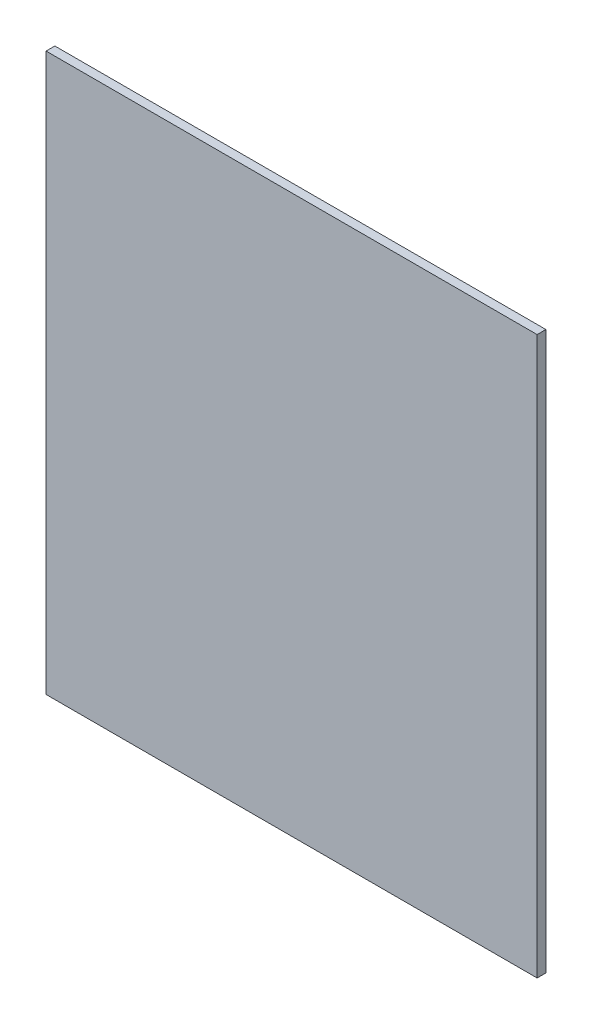
ISO-10303-21;
HEADER;
FILE_DESCRIPTION(('STEP AP214'),'2;1');
FILE_NAME('part.step','',(''),(''),'','','');
FILE_SCHEMA(('AUTOMOTIVE_DESIGN { 1 0 10303 214 1 1 1 1 }'));
ENDSEC;
DATA;
#1=APPLICATION_CONTEXT('core data for automotive mechanical design processes');
#2=APPLICATION_PROTOCOL_DEFINITION('international standard','automotive_design',2000,#1);
#3=PRODUCT_CONTEXT('',#1,'mechanical');
#4=PRODUCT('Part','Part','',(#3));
#5=PRODUCT_RELATED_PRODUCT_CATEGORY('part','',(#4));
#6=PRODUCT_DEFINITION_FORMATION('','',#4);
#7=PRODUCT_DEFINITION_CONTEXT('part definition',#1,'design');
#8=PRODUCT_DEFINITION('design','',#6,#7);
#9=PRODUCT_DEFINITION_SHAPE('','',#8);
#10=(LENGTH_UNIT() NAMED_UNIT(*) SI_UNIT(.MILLI.,.METRE.));
#11=(NAMED_UNIT(*) PLANE_ANGLE_UNIT() SI_UNIT($,.RADIAN.));
#12=(NAMED_UNIT(*) SI_UNIT($,.STERADIAN.) SOLID_ANGLE_UNIT());
#13=UNCERTAINTY_MEASURE_WITH_UNIT(LENGTH_MEASURE(1.E-05),#10,'distance_accuracy_value','');
#14=(GEOMETRIC_REPRESENTATION_CONTEXT(3) GLOBAL_UNCERTAINTY_ASSIGNED_CONTEXT((#13)) GLOBAL_UNIT_ASSIGNED_CONTEXT((#10,
#11,#12)) REPRESENTATION_CONTEXT('',''));
#15=CARTESIAN_POINT('',(0.,0.,0.));
#16=DIRECTION('',(0.,0.,1.));
#17=DIRECTION('',(1.,0.,0.));
#18=AXIS2_PLACEMENT_3D('',#15,#16,#17);
#19=CARTESIAN_POINT('',(-28.,65.4910721402382,14.25));
#20=DIRECTION('',(-1.,0.,0.));
#21=DIRECTION('',(0.,0.,1.));
#22=AXIS2_PLACEMENT_3D('',#19,#20,#21);
#23=PLANE('',#22);
#24=DIRECTION('',(0.,1.,0.));
#25=VECTOR('',#24,1.);
#26=CARTESIAN_POINT('',(-28.,65.4910721402382,14.25));
#27=LINE('',#26,#25);
#28=CARTESIAN_POINT('',(-28.,122.5,14.25));
#29=VERTEX_POINT('',#28);
#30=CARTESIAN_POINT('',(-28.,186.05,14.25));
#31=VERTEX_POINT('',#30);
#32=EDGE_CURVE('E11',#29,#31,#27,.T.);
#33=ORIENTED_EDGE('',*,*,#32,.F.);
#34=DIRECTION('',(0.,0.,-1.));
#35=VECTOR('',#34,1.);
#36=CARTESIAN_POINT('',(-28.,122.5,15.25));
#37=LINE('',#36,#35);
#38=CARTESIAN_POINT('',(-28.,122.5,15.25));
#39=VERTEX_POINT('',#38);
#40=EDGE_CURVE('E84',#39,#29,#37,.T.);
#41=ORIENTED_EDGE('',*,*,#40,.F.);
#42=DIRECTION('',(0.,1.,0.));
#43=VECTOR('',#42,1.);
#44=CARTESIAN_POINT('',(-28.,65.4910721402382,15.25));
#45=LINE('',#44,#43);
#46=CARTESIAN_POINT('',(-28.,186.05,15.25));
#47=VERTEX_POINT('',#46);
#48=EDGE_CURVE('E45',#39,#47,#45,.T.);
#49=ORIENTED_EDGE('',*,*,#48,.T.);
#50=DIRECTION('',(0.,0.,1.));
#51=VECTOR('',#50,1.);
#52=CARTESIAN_POINT('',(-28.,186.05,14.25));
#53=LINE('',#52,#51);
#54=EDGE_CURVE('E114',#31,#47,#53,.T.);
#55=ORIENTED_EDGE('',*,*,#54,.F.);
#56=EDGE_LOOP('',(#33,#41,#49,#55));
#57=FACE_BOUND('',#56,.T.);
#58=ADVANCED_FACE('F42',(#57),#23,.T.);
#59=CARTESIAN_POINT('',(-28.,65.4910721402382,14.25));
#60=DIRECTION('',(0.,0.,-1.));
#61=DIRECTION('',(-1.,0.,0.));
#62=AXIS2_PLACEMENT_3D('',#59,#60,#61);
#63=PLANE('',#62);
#64=DIRECTION('',(0.,1.,0.));
#65=VECTOR('',#64,1.);
#66=CARTESIAN_POINT('',(28.,65.4910721402382,14.25));
#67=LINE('',#66,#65);
#68=CARTESIAN_POINT('',(28.,122.5,14.25));
#69=VERTEX_POINT('',#68);
#70=CARTESIAN_POINT('',(28.,186.05,14.25));
#71=VERTEX_POINT('',#70);
#72=EDGE_CURVE('E51',#69,#71,#67,.T.);
#73=ORIENTED_EDGE('',*,*,#72,.F.);
#74=DIRECTION('',(1.,0.,0.));
#75=VECTOR('',#74,1.);
#76=CARTESIAN_POINT('',(-28.,122.5,14.25));
#77=LINE('',#76,#75);
#78=EDGE_CURVE('E96',#29,#69,#77,.T.);
#79=ORIENTED_EDGE('',*,*,#78,.F.);
#80=ORIENTED_EDGE('',*,*,#32,.T.);
#81=DIRECTION('',(-1.,0.,0.));
#82=VECTOR('',#81,1.);
#83=CARTESIAN_POINT('',(28.,186.05,14.25));
#84=LINE('',#83,#82);
#85=EDGE_CURVE('E124',#71,#31,#84,.T.);
#86=ORIENTED_EDGE('',*,*,#85,.F.);
#87=EDGE_LOOP('',(#73,#79,#80,#86));
#88=FACE_BOUND('',#87,.T.);
#89=ADVANCED_FACE('F135',(#88),#63,.T.);
#90=CARTESIAN_POINT('',(28.,65.4910721402382,14.25));
#91=DIRECTION('',(1.,0.,0.));
#92=DIRECTION('',(0.,0.,-1.));
#93=AXIS2_PLACEMENT_3D('',#90,#91,#92);
#94=PLANE('',#93);
#95=DIRECTION('',(0.,1.,0.));
#96=VECTOR('',#95,1.);
#97=CARTESIAN_POINT('',(28.,65.4910721402382,15.25));
#98=LINE('',#97,#96);
#99=CARTESIAN_POINT('',(28.,122.5,15.25));
#100=VERTEX_POINT('',#99);
#101=CARTESIAN_POINT('',(28.,186.05,15.25));
#102=VERTEX_POINT('',#101);
#103=EDGE_CURVE('E103',#100,#102,#98,.T.);
#104=ORIENTED_EDGE('',*,*,#103,.F.);
#105=DIRECTION('',(0.,0.,1.));
#106=VECTOR('',#105,1.);
#107=CARTESIAN_POINT('',(28.,122.5,14.25));
#108=LINE('',#107,#106);
#109=EDGE_CURVE('E59',#69,#100,#108,.T.);
#110=ORIENTED_EDGE('',*,*,#109,.F.);
#111=ORIENTED_EDGE('',*,*,#72,.T.);
#112=DIRECTION('',(0.,0.,-1.));
#113=VECTOR('',#112,1.);
#114=CARTESIAN_POINT('',(28.,186.05,15.25));
#115=LINE('',#114,#113);
#116=EDGE_CURVE('E104',#102,#71,#115,.T.);
#117=ORIENTED_EDGE('',*,*,#116,.F.);
#118=EDGE_LOOP('',(#104,#110,#111,#117));
#119=FACE_BOUND('',#118,.T.);
#120=ADVANCED_FACE('F134',(#119),#94,.T.);
#121=CARTESIAN_POINT('',(-28.,65.4910721402382,15.25));
#122=DIRECTION('',(0.,0.,1.));
#123=DIRECTION('',(1.,0.,0.));
#124=AXIS2_PLACEMENT_3D('',#121,#122,#123);
#125=PLANE('',#124);
#126=ORIENTED_EDGE('',*,*,#48,.F.);
#127=DIRECTION('',(-1.,0.,0.));
#128=VECTOR('',#127,1.);
#129=CARTESIAN_POINT('',(28.,122.5,15.25));
#130=LINE('',#129,#128);
#131=EDGE_CURVE('E81',#100,#39,#130,.T.);
#132=ORIENTED_EDGE('',*,*,#131,.F.);
#133=ORIENTED_EDGE('',*,*,#103,.T.);
#134=DIRECTION('',(1.,0.,0.));
#135=VECTOR('',#134,1.);
#136=CARTESIAN_POINT('',(-28.,186.05,15.25));
#137=LINE('',#136,#135);
#138=EDGE_CURVE('E101',#47,#102,#137,.T.);
#139=ORIENTED_EDGE('',*,*,#138,.F.);
#140=EDGE_LOOP('',(#126,#132,#133,#139));
#141=FACE_BOUND('',#140,.T.);
#142=ADVANCED_FACE('F99',(#141),#125,.T.);
#143=CARTESIAN_POINT('',(0.,186.05,0.));
#144=DIRECTION('',(0.,1.,0.));
#145=DIRECTION('',(0.,0.,1.));
#146=AXIS2_PLACEMENT_3D('',#143,#144,#145);
#147=PLANE('',#146);
#148=ORIENTED_EDGE('',*,*,#85,.T.);
#149=ORIENTED_EDGE('',*,*,#54,.T.);
#150=ORIENTED_EDGE('',*,*,#138,.T.);
#151=ORIENTED_EDGE('',*,*,#116,.T.);
#152=EDGE_LOOP('',(#148,#149,#150,#151));
#153=FACE_BOUND('',#152,.T.);
#154=ADVANCED_FACE('F136',(#153),#147,.T.);
#155=CARTESIAN_POINT('',(0.,122.5,0.));
#156=DIRECTION('',(0.,-1.,0.));
#157=DIRECTION('',(0.,0.,-1.));
#158=AXIS2_PLACEMENT_3D('',#155,#156,#157);
#159=PLANE('',#158);
#160=ORIENTED_EDGE('',*,*,#131,.T.);
#161=ORIENTED_EDGE('',*,*,#40,.T.);
#162=ORIENTED_EDGE('',*,*,#78,.T.);
#163=ORIENTED_EDGE('',*,*,#109,.T.);
#164=EDGE_LOOP('',(#160,#161,#162,#163));
#165=FACE_BOUND('',#164,.T.);
#166=ADVANCED_FACE('F83',(#165),#159,.T.);
#167=CLOSED_SHELL('',(#58,#89,#120,#142,#154,#166));
#168=MANIFOLD_SOLID_BREP('B2',#167);
#169=ADVANCED_BREP_SHAPE_REPRESENTATION('',(#18,#168),#14);
#170=SHAPE_DEFINITION_REPRESENTATION(#9,#169);
ENDSEC;
END-ISO-10303-21;
